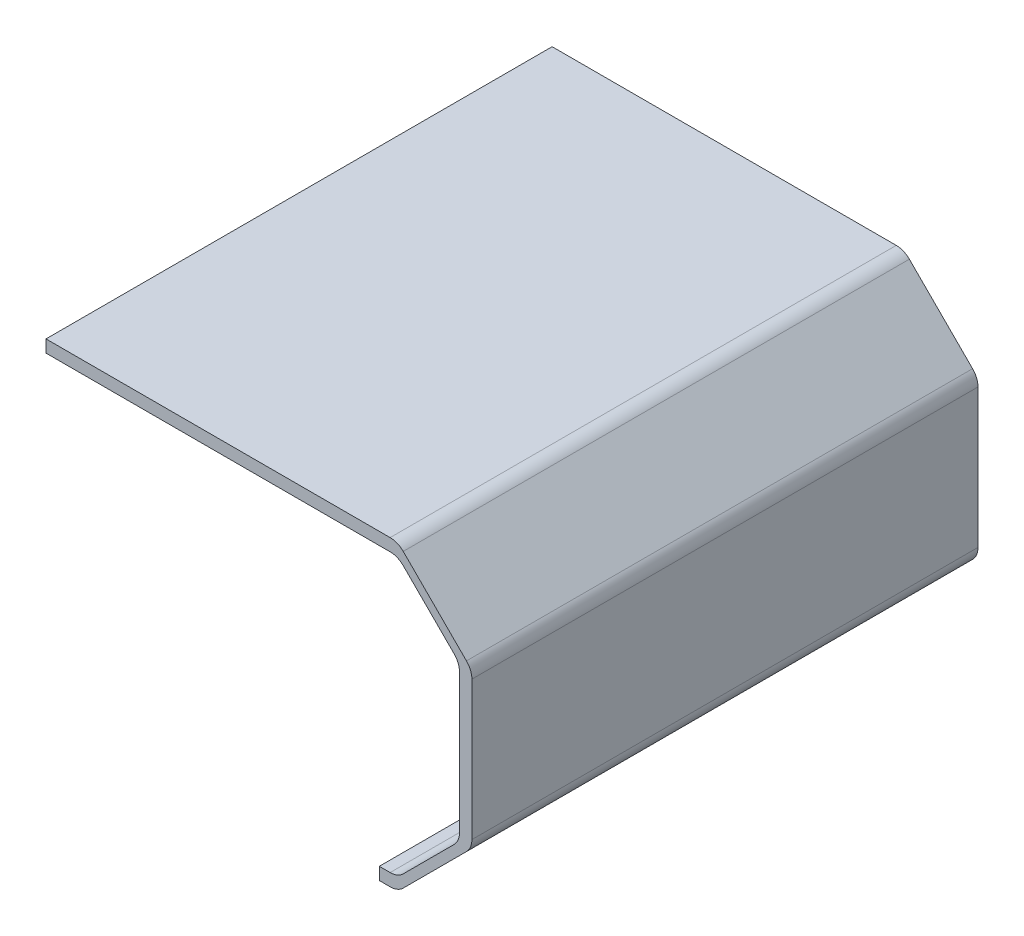
ISO-10303-21;
HEADER;
FILE_DESCRIPTION(('STEP AP214'),'2;1');
FILE_NAME('part.step','',(''),(''),'','','');
FILE_SCHEMA(('AUTOMOTIVE_DESIGN { 1 0 10303 214 1 1 1 1 }'));
ENDSEC;
DATA;
#1=APPLICATION_CONTEXT('core data for automotive mechanical design processes');
#2=APPLICATION_PROTOCOL_DEFINITION('international standard','automotive_design',2000,#1);
#3=PRODUCT_CONTEXT('',#1,'mechanical');
#4=PRODUCT('Part','Part','',(#3));
#5=PRODUCT_RELATED_PRODUCT_CATEGORY('part','',(#4));
#6=PRODUCT_DEFINITION_FORMATION('','',#4);
#7=PRODUCT_DEFINITION_CONTEXT('part definition',#1,'design');
#8=PRODUCT_DEFINITION('design','',#6,#7);
#9=PRODUCT_DEFINITION_SHAPE('','',#8);
#10=(LENGTH_UNIT() NAMED_UNIT(*) SI_UNIT(.MILLI.,.METRE.));
#11=(NAMED_UNIT(*) PLANE_ANGLE_UNIT() SI_UNIT($,.RADIAN.));
#12=(NAMED_UNIT(*) SI_UNIT($,.STERADIAN.) SOLID_ANGLE_UNIT());
#13=UNCERTAINTY_MEASURE_WITH_UNIT(LENGTH_MEASURE(1.E-05),#10,'distance_accuracy_value','');
#14=(GEOMETRIC_REPRESENTATION_CONTEXT(3) GLOBAL_UNCERTAINTY_ASSIGNED_CONTEXT((#13)) GLOBAL_UNIT_ASSIGNED_CONTEXT((#10,
#11,#12)) REPRESENTATION_CONTEXT('',''));
#15=CARTESIAN_POINT('',(0.,0.,0.));
#16=DIRECTION('',(0.,0.,1.));
#17=DIRECTION('',(1.,0.,0.));
#18=AXIS2_PLACEMENT_3D('',#15,#16,#17);
#19=CARTESIAN_POINT('',(0.,0.,82.));
#20=DIRECTION('',(0.,1.,0.));
#21=DIRECTION('',(0.,0.,1.));
#22=AXIS2_PLACEMENT_3D('',#19,#20,#21);
#23=PLANE('',#22);
#24=DIRECTION('',(1.,0.,0.));
#25=VECTOR('',#24,1.);
#26=CARTESIAN_POINT('',(0.,0.,0.));
#27=LINE('',#26,#25);
#28=CARTESIAN_POINT('',(0.,0.,0.));
#29=VERTEX_POINT('',#28);
#30=CARTESIAN_POINT('',(1.75735931288072,0.,0.));
#31=VERTEX_POINT('',#30);
#32=EDGE_CURVE('E229',#29,#31,#27,.T.);
#33=ORIENTED_EDGE('',*,*,#32,.T.);
#34=DIRECTION('',(0.,0.,-1.));
#35=VECTOR('',#34,1.);
#36=CARTESIAN_POINT('',(1.75735931288072,0.,82.));
#37=LINE('',#36,#35);
#38=CARTESIAN_POINT('',(1.75735931288072,0.,82.));
#39=VERTEX_POINT('',#38);
#40=EDGE_CURVE('E327',#31,#39,#37,.F.);
#41=ORIENTED_EDGE('',*,*,#40,.T.);
#42=DIRECTION('',(1.,0.,0.));
#43=VECTOR('',#42,1.);
#44=CARTESIAN_POINT('',(0.,0.,82.));
#45=LINE('',#44,#43);
#46=CARTESIAN_POINT('',(0.,0.,82.));
#47=VERTEX_POINT('',#46);
#48=EDGE_CURVE('E271',#47,#39,#45,.T.);
#49=ORIENTED_EDGE('',*,*,#48,.F.);
#50=DIRECTION('',(0.,0.,-1.));
#51=VECTOR('',#50,1.);
#52=CARTESIAN_POINT('',(0.,0.,82.));
#53=LINE('',#52,#51);
#54=EDGE_CURVE('E228',#47,#29,#53,.T.);
#55=ORIENTED_EDGE('',*,*,#54,.T.);
#56=EDGE_LOOP('',(#33,#41,#49,#55));
#57=FACE_BOUND('',#56,.T.);
#58=ADVANCED_FACE('F39',(#57),#23,.F.);
#59=CARTESIAN_POINT('',(3.,0.,82.));
#60=DIRECTION('',(-0.707106781186547,0.707106781186547,0.));
#61=DIRECTION('',(-0.707106781186548,-0.707106781186548,0.));
#62=AXIS2_PLACEMENT_3D('',#59,#60,#61);
#63=PLANE('',#62);
#64=DIRECTION('',(0.707106781186548,0.707106781186548,0.));
#65=VECTOR('',#64,1.);
#66=CARTESIAN_POINT('',(3.,0.,82.));
#67=LINE('',#66,#65);
#68=CARTESIAN_POINT('',(3.87867965644036,0.878679656440358,82.));
#69=VERTEX_POINT('',#68);
#70=CARTESIAN_POINT('',(14.1213203435628,11.1213203435628,82.));
#71=VERTEX_POINT('',#70);
#72=EDGE_CURVE('E429',#69,#71,#67,.T.);
#73=ORIENTED_EDGE('',*,*,#72,.F.);
#74=DIRECTION('',(0.,0.,-1.));
#75=VECTOR('',#74,1.);
#76=CARTESIAN_POINT('',(3.87867965644036,0.878679656440358,82.));
#77=LINE('',#76,#75);
#78=CARTESIAN_POINT('',(3.87867965644036,0.878679656440358,0.));
#79=VERTEX_POINT('',#78);
#80=EDGE_CURVE('E311',#69,#79,#77,.T.);
#81=ORIENTED_EDGE('',*,*,#80,.T.);
#82=DIRECTION('',(0.707106781186548,0.707106781186548,0.));
#83=VECTOR('',#82,1.);
#84=CARTESIAN_POINT('',(3.,0.,0.));
#85=LINE('',#84,#83);
#86=CARTESIAN_POINT('',(14.1213203435628,11.1213203435628,0.));
#87=VERTEX_POINT('',#86);
#88=EDGE_CURVE('E233',#79,#87,#85,.T.);
#89=ORIENTED_EDGE('',*,*,#88,.T.);
#90=DIRECTION('',(0.,0.,-1.));
#91=VECTOR('',#90,1.);
#92=CARTESIAN_POINT('',(14.1213203435628,11.1213203435628,82.));
#93=LINE('',#92,#91);
#94=EDGE_CURVE('E308',#87,#71,#93,.F.);
#95=ORIENTED_EDGE('',*,*,#94,.T.);
#96=EDGE_LOOP('',(#73,#81,#89,#95));
#97=FACE_BOUND('',#96,.T.);
#98=ADVANCED_FACE('F436',(#97),#63,.F.);
#99=CARTESIAN_POINT('',(15.0000000000032,12.0000000000032,82.));
#100=DIRECTION('',(-1.,0.,0.));
#101=DIRECTION('',(0.,-1.,0.));
#102=AXIS2_PLACEMENT_3D('',#99,#100,#101);
#103=PLANE('',#102);
#104=DIRECTION('',(0.,1.,0.));
#105=VECTOR('',#104,1.);
#106=CARTESIAN_POINT('',(15.0000000000032,12.0000000000032,82.));
#107=LINE('',#106,#105);
#108=CARTESIAN_POINT('',(15.0000000000032,13.2426406871225,82.));
#109=VERTEX_POINT('',#108);
#110=CARTESIAN_POINT('',(15.0000000000032,35.7573593128778,82.));
#111=VERTEX_POINT('',#110);
#112=EDGE_CURVE('E449',#109,#111,#107,.T.);
#113=ORIENTED_EDGE('',*,*,#112,.F.);
#114=DIRECTION('',(0.,0.,-1.));
#115=VECTOR('',#114,1.);
#116=CARTESIAN_POINT('',(15.0000000000032,13.2426406871225,82.));
#117=LINE('',#116,#115);
#118=CARTESIAN_POINT('',(15.0000000000032,13.2426406871225,0.));
#119=VERTEX_POINT('',#118);
#120=EDGE_CURVE('E344',#109,#119,#117,.T.);
#121=ORIENTED_EDGE('',*,*,#120,.T.);
#122=DIRECTION('',(0.,1.,0.));
#123=VECTOR('',#122,1.);
#124=CARTESIAN_POINT('',(15.0000000000032,12.0000000000032,0.));
#125=LINE('',#124,#123);
#126=CARTESIAN_POINT('',(15.0000000000032,35.7573593128778,0.));
#127=VERTEX_POINT('',#126);
#128=EDGE_CURVE('E237',#119,#127,#125,.T.);
#129=ORIENTED_EDGE('',*,*,#128,.T.);
#130=DIRECTION('',(0.,0.,-1.));
#131=VECTOR('',#130,1.);
#132=CARTESIAN_POINT('',(15.0000000000032,35.7573593128779,82.));
#133=LINE('',#132,#131);
#134=EDGE_CURVE('E341',#127,#111,#133,.F.);
#135=ORIENTED_EDGE('',*,*,#134,.T.);
#136=EDGE_LOOP('',(#113,#121,#129,#135));
#137=FACE_BOUND('',#136,.T.);
#138=ADVANCED_FACE('F446',(#137),#103,.F.);
#139=CARTESIAN_POINT('',(3.00000000000458,48.9999999999954,82.));
#140=DIRECTION('',(-0.707106781186537,-0.707106781186558,0.));
#141=DIRECTION('',(0.707106781186558,-0.707106781186537,0.));
#142=AXIS2_PLACEMENT_3D('',#139,#140,#141);
#143=PLANE('',#142);
#144=DIRECTION('',(-0.707106781186558,0.707106781186537,0.));
#145=VECTOR('',#144,1.);
#146=CARTESIAN_POINT('',(3.00000000000458,48.9999999999954,82.));
#147=LINE('',#146,#145);
#148=CARTESIAN_POINT('',(14.1213203435628,37.8786796564375,82.));
#149=VERTEX_POINT('',#148);
#150=CARTESIAN_POINT('',(3.87867965644493,48.1213203435551,82.));
#151=VERTEX_POINT('',#150);
#152=EDGE_CURVE('E187',#149,#151,#147,.T.);
#153=ORIENTED_EDGE('',*,*,#152,.F.);
#154=DIRECTION('',(0.,0.,-1.));
#155=VECTOR('',#154,1.);
#156=CARTESIAN_POINT('',(14.1213203435628,37.8786796564375,82.));
#157=LINE('',#156,#155);
#158=CARTESIAN_POINT('',(14.1213203435628,37.8786796564375,0.));
#159=VERTEX_POINT('',#158);
#160=EDGE_CURVE('E350',#149,#159,#157,.T.);
#161=ORIENTED_EDGE('',*,*,#160,.T.);
#162=DIRECTION('',(-0.707106781186558,0.707106781186537,0.));
#163=VECTOR('',#162,1.);
#164=CARTESIAN_POINT('',(3.00000000000458,48.9999999999954,0.));
#165=LINE('',#164,#163);
#166=CARTESIAN_POINT('',(3.87867965644493,48.1213203435551,0.));
#167=VERTEX_POINT('',#166);
#168=EDGE_CURVE('E241',#159,#167,#165,.T.);
#169=ORIENTED_EDGE('',*,*,#168,.T.);
#170=DIRECTION('',(0.,0.,-1.));
#171=VECTOR('',#170,1.);
#172=CARTESIAN_POINT('',(3.87867965644493,48.1213203435551,82.));
#173=LINE('',#172,#171);
#174=EDGE_CURVE('E63',#167,#151,#173,.F.);
#175=ORIENTED_EDGE('',*,*,#174,.T.);
#176=EDGE_LOOP('',(#153,#161,#169,#175));
#177=FACE_BOUND('',#176,.T.);
#178=ADVANCED_FACE('F459',(#177),#143,.F.);
#179=CARTESIAN_POINT('',(-54.,48.9999999999956,82.));
#180=DIRECTION('',(0.,-1.,0.));
#181=DIRECTION('',(1.,0.,0.));
#182=AXIS2_PLACEMENT_3D('',#179,#180,#181);
#183=PLANE('',#182);
#184=DIRECTION('',(-1.,0.,0.));
#185=VECTOR('',#184,1.);
#186=CARTESIAN_POINT('',(-54.,48.9999999999956,82.));
#187=LINE('',#186,#185);
#188=CARTESIAN_POINT('',(1.75735931288532,48.9999999999954,82.));
#189=VERTEX_POINT('',#188);
#190=CARTESIAN_POINT('',(-54.,48.9999999999956,82.));
#191=VERTEX_POINT('',#190);
#192=EDGE_CURVE('E175',#189,#191,#187,.T.);
#193=ORIENTED_EDGE('',*,*,#192,.F.);
#194=DIRECTION('',(0.,0.,-1.));
#195=VECTOR('',#194,1.);
#196=CARTESIAN_POINT('',(1.75735931288532,48.9999999999954,82.));
#197=LINE('',#196,#195);
#198=CARTESIAN_POINT('',(1.75735931288532,48.9999999999954,0.));
#199=VERTEX_POINT('',#198);
#200=EDGE_CURVE('E354',#189,#199,#197,.T.);
#201=ORIENTED_EDGE('',*,*,#200,.T.);
#202=DIRECTION('',(-1.,0.,0.));
#203=VECTOR('',#202,1.);
#204=CARTESIAN_POINT('',(-54.,48.9999999999956,0.));
#205=LINE('',#204,#203);
#206=CARTESIAN_POINT('',(-54.,48.9999999999956,0.));
#207=VERTEX_POINT('',#206);
#208=EDGE_CURVE('E193',#199,#207,#205,.T.);
#209=ORIENTED_EDGE('',*,*,#208,.T.);
#210=DIRECTION('',(0.,0.,-1.));
#211=VECTOR('',#210,1.);
#212=CARTESIAN_POINT('',(-54.,48.9999999999956,82.));
#213=LINE('',#212,#211);
#214=EDGE_CURVE('E190',#191,#207,#213,.T.);
#215=ORIENTED_EDGE('',*,*,#214,.F.);
#216=EDGE_LOOP('',(#193,#201,#209,#215));
#217=FACE_BOUND('',#216,.T.);
#218=ADVANCED_FACE('F191',(#217),#183,.F.);
#219=CARTESIAN_POINT('',(-54.,48.9999999999956,82.));
#220=DIRECTION('',(1.,0.,0.));
#221=DIRECTION('',(0.,0.,-1.));
#222=AXIS2_PLACEMENT_3D('',#219,#220,#221);
#223=PLANE('',#222);
#224=DIRECTION('',(0.,-1.,0.));
#225=VECTOR('',#224,1.);
#226=CARTESIAN_POINT('',(-54.,48.9999999999956,0.));
#227=LINE('',#226,#225);
#228=CARTESIAN_POINT('',(-54.,46.9999999999961,0.));
#229=VERTEX_POINT('',#228);
#230=EDGE_CURVE('E246',#207,#229,#227,.T.);
#231=ORIENTED_EDGE('',*,*,#230,.T.);
#232=DIRECTION('',(0.,0.,-1.));
#233=VECTOR('',#232,1.);
#234=CARTESIAN_POINT('',(-54.,46.9999999999961,82.));
#235=LINE('',#234,#233);
#236=CARTESIAN_POINT('',(-54.,46.9999999999961,82.));
#237=VERTEX_POINT('',#236);
#238=EDGE_CURVE('E198',#237,#229,#235,.T.);
#239=ORIENTED_EDGE('',*,*,#238,.F.);
#240=DIRECTION('',(0.,-1.,0.));
#241=VECTOR('',#240,1.);
#242=CARTESIAN_POINT('',(-54.,48.9999999999956,82.));
#243=LINE('',#242,#241);
#244=EDGE_CURVE('E181',#191,#237,#243,.T.);
#245=ORIENTED_EDGE('',*,*,#244,.F.);
#246=ORIENTED_EDGE('',*,*,#214,.T.);
#247=EDGE_LOOP('',(#231,#239,#245,#246));
#248=FACE_BOUND('',#247,.T.);
#249=ADVANCED_FACE('F200',(#248),#223,.F.);
#250=CARTESIAN_POINT('',(3.00000000000477,46.9999999999961,82.));
#251=DIRECTION('',(0.,1.,0.));
#252=DIRECTION('',(0.,0.,1.));
#253=AXIS2_PLACEMENT_3D('',#250,#251,#252);
#254=PLANE('',#253);
#255=DIRECTION('',(1.,0.,0.));
#256=VECTOR('',#255,1.);
#257=CARTESIAN_POINT('',(3.00000000000477,46.9999999999961,0.));
#258=LINE('',#257,#256);
#259=CARTESIAN_POINT('',(1.75735931288549,46.9999999999961,0.));
#260=VERTEX_POINT('',#259);
#261=EDGE_CURVE('E249',#229,#260,#258,.T.);
#262=ORIENTED_EDGE('',*,*,#261,.T.);
#263=DIRECTION('',(0.,0.,-1.));
#264=VECTOR('',#263,1.);
#265=CARTESIAN_POINT('',(1.75735931288549,46.9999999999961,82.));
#266=LINE('',#265,#264);
#267=CARTESIAN_POINT('',(1.75735931288549,46.9999999999961,82.));
#268=VERTEX_POINT('',#267);
#269=EDGE_CURVE('E305',#260,#268,#266,.F.);
#270=ORIENTED_EDGE('',*,*,#269,.T.);
#271=DIRECTION('',(1.,0.,0.));
#272=VECTOR('',#271,1.);
#273=CARTESIAN_POINT('',(3.00000000000477,46.9999999999961,82.));
#274=LINE('',#273,#272);
#275=EDGE_CURVE('E204',#237,#268,#274,.T.);
#276=ORIENTED_EDGE('',*,*,#275,.F.);
#277=ORIENTED_EDGE('',*,*,#238,.T.);
#278=EDGE_LOOP('',(#262,#270,#276,#277));
#279=FACE_BOUND('',#278,.T.);
#280=ADVANCED_FACE('F384',(#279),#254,.F.);
#281=CARTESIAN_POINT('',(3.00000000000477,46.9999999999961,82.));
#282=DIRECTION('',(0.707106781186547,0.707106781186548,0.));
#283=DIRECTION('',(-0.707106781186548,0.707106781186547,0.));
#284=AXIS2_PLACEMENT_3D('',#281,#282,#283);
#285=PLANE('',#284);
#286=DIRECTION('',(0.707106781186548,-0.707106781186547,0.));
#287=VECTOR('',#286,1.);
#288=CARTESIAN_POINT('',(3.00000000000477,46.9999999999961,0.));
#289=LINE('',#288,#287);
#290=CARTESIAN_POINT('',(3.87867965644513,46.1213203435558,0.));
#291=VERTEX_POINT('',#290);
#292=CARTESIAN_POINT('',(12.1213203435631,37.8786796564378,0.));
#293=VERTEX_POINT('',#292);
#294=EDGE_CURVE('E253',#291,#293,#289,.T.);
#295=ORIENTED_EDGE('',*,*,#294,.T.);
#296=DIRECTION('',(0.,0.,-1.));
#297=VECTOR('',#296,1.);
#298=CARTESIAN_POINT('',(12.1213203435631,37.8786796564378,82.));
#299=LINE('',#298,#297);
#300=CARTESIAN_POINT('',(12.1213203435631,37.8786796564378,82.));
#301=VERTEX_POINT('',#300);
#302=EDGE_CURVE('E302',#293,#301,#299,.F.);
#303=ORIENTED_EDGE('',*,*,#302,.T.);
#304=DIRECTION('',(0.707106781186548,-0.707106781186547,0.));
#305=VECTOR('',#304,1.);
#306=CARTESIAN_POINT('',(3.00000000000477,46.9999999999961,82.));
#307=LINE('',#306,#305);
#308=CARTESIAN_POINT('',(3.87867965644513,46.1213203435558,82.));
#309=VERTEX_POINT('',#308);
#310=EDGE_CURVE('E207',#309,#301,#307,.T.);
#311=ORIENTED_EDGE('',*,*,#310,.F.);
#312=DIRECTION('',(0.,0.,-1.));
#313=VECTOR('',#312,1.);
#314=CARTESIAN_POINT('',(3.87867965644513,46.1213203435558,0.));
#315=LINE('',#314,#313);
#316=EDGE_CURVE('E298',#309,#291,#315,.T.);
#317=ORIENTED_EDGE('',*,*,#316,.T.);
#318=EDGE_LOOP('',(#295,#303,#311,#317));
#319=FACE_BOUND('',#318,.T.);
#320=ADVANCED_FACE('F390',(#319),#285,.F.);
#321=CARTESIAN_POINT('',(13.0000000000035,36.9999999999974,82.));
#322=DIRECTION('',(1.,0.,0.));
#323=DIRECTION('',(0.,1.,0.));
#324=AXIS2_PLACEMENT_3D('',#321,#322,#323);
#325=PLANE('',#324);
#326=DIRECTION('',(0.,-1.,0.));
#327=VECTOR('',#326,1.);
#328=CARTESIAN_POINT('',(13.0000000000035,36.9999999999974,0.));
#329=LINE('',#328,#327);
#330=CARTESIAN_POINT('',(13.0000000000035,35.7573593128782,0.));
#331=VERTEX_POINT('',#330);
#332=CARTESIAN_POINT('',(13.0000000000035,13.2426406871171,0.));
#333=VERTEX_POINT('',#332);
#334=EDGE_CURVE('E257',#331,#333,#329,.T.);
#335=ORIENTED_EDGE('',*,*,#334,.T.);
#336=DIRECTION('',(0.,0.,-1.));
#337=VECTOR('',#336,1.);
#338=CARTESIAN_POINT('',(13.0000000000035,13.2426406871171,82.));
#339=LINE('',#338,#337);
#340=CARTESIAN_POINT('',(13.0000000000035,13.2426406871171,82.));
#341=VERTEX_POINT('',#340);
#342=EDGE_CURVE('E295',#333,#341,#339,.F.);
#343=ORIENTED_EDGE('',*,*,#342,.T.);
#344=DIRECTION('',(0.,-1.,0.));
#345=VECTOR('',#344,1.);
#346=CARTESIAN_POINT('',(13.0000000000035,36.9999999999974,82.));
#347=LINE('',#346,#345);
#348=CARTESIAN_POINT('',(13.0000000000035,35.7573593128782,82.));
#349=VERTEX_POINT('',#348);
#350=EDGE_CURVE('E214',#349,#341,#347,.T.);
#351=ORIENTED_EDGE('',*,*,#350,.F.);
#352=DIRECTION('',(0.,0.,-1.));
#353=VECTOR('',#352,1.);
#354=CARTESIAN_POINT('',(13.0000000000035,35.7573593128782,0.));
#355=LINE('',#354,#353);
#356=EDGE_CURVE('E291',#349,#331,#355,.T.);
#357=ORIENTED_EDGE('',*,*,#356,.T.);
#358=EDGE_LOOP('',(#335,#343,#351,#357));
#359=FACE_BOUND('',#358,.T.);
#360=ADVANCED_FACE('F398',(#359),#325,.F.);
#361=CARTESIAN_POINT('',(3.00000000000361,1.99999999999793,82.));
#362=DIRECTION('',(0.707106781186548,-0.707106781186548,0.));
#363=DIRECTION('',(0.707106781186548,0.707106781186548,0.));
#364=AXIS2_PLACEMENT_3D('',#361,#362,#363);
#365=PLANE('',#364);
#366=DIRECTION('',(-0.707106781186547,-0.707106781186547,0.));
#367=VECTOR('',#366,1.);
#368=CARTESIAN_POINT('',(3.00000000000361,1.99999999999793,0.));
#369=LINE('',#368,#367);
#370=CARTESIAN_POINT('',(12.1213203435631,11.1213203435574,0.));
#371=VERTEX_POINT('',#370);
#372=CARTESIAN_POINT('',(3.87867965644396,2.87867965643829,0.));
#373=VERTEX_POINT('',#372);
#374=EDGE_CURVE('E261',#371,#373,#369,.T.);
#375=ORIENTED_EDGE('',*,*,#374,.T.);
#376=DIRECTION('',(0.,0.,-1.));
#377=VECTOR('',#376,1.);
#378=CARTESIAN_POINT('',(3.87867965644396,2.87867965643829,82.));
#379=LINE('',#378,#377);
#380=CARTESIAN_POINT('',(3.87867965644396,2.87867965643829,82.));
#381=VERTEX_POINT('',#380);
#382=EDGE_CURVE('E288',#373,#381,#379,.F.);
#383=ORIENTED_EDGE('',*,*,#382,.T.);
#384=DIRECTION('',(-0.707106781186547,-0.707106781186547,0.));
#385=VECTOR('',#384,1.);
#386=CARTESIAN_POINT('',(3.00000000000361,1.99999999999793,82.));
#387=LINE('',#386,#385);
#388=CARTESIAN_POINT('',(12.1213203435631,11.1213203435574,82.));
#389=VERTEX_POINT('',#388);
#390=EDGE_CURVE('E218',#389,#381,#387,.T.);
#391=ORIENTED_EDGE('',*,*,#390,.F.);
#392=DIRECTION('',(0.,0.,-1.));
#393=VECTOR('',#392,1.);
#394=CARTESIAN_POINT('',(12.1213203435631,11.1213203435574,0.));
#395=LINE('',#394,#393);
#396=EDGE_CURVE('E284',#389,#371,#395,.T.);
#397=ORIENTED_EDGE('',*,*,#396,.T.);
#398=EDGE_LOOP('',(#375,#383,#391,#397));
#399=FACE_BOUND('',#398,.T.);
#400=ADVANCED_FACE('F407',(#399),#365,.F.);
#401=CARTESIAN_POINT('',(0.,1.99999999999793,82.));
#402=DIRECTION('',(0.,-1.,0.));
#403=DIRECTION('',(1.,0.,0.));
#404=AXIS2_PLACEMENT_3D('',#401,#402,#403);
#405=PLANE('',#404);
#406=DIRECTION('',(-1.,0.,0.));
#407=VECTOR('',#406,1.);
#408=CARTESIAN_POINT('',(0.,1.99999999999793,82.));
#409=LINE('',#408,#407);
#410=CARTESIAN_POINT('',(1.75735931288432,1.99999999999793,82.));
#411=VERTEX_POINT('',#410);
#412=CARTESIAN_POINT('',(0.,1.99999999999793,82.));
#413=VERTEX_POINT('',#412);
#414=EDGE_CURVE('E222',#411,#413,#409,.T.);
#415=ORIENTED_EDGE('',*,*,#414,.F.);
#416=DIRECTION('',(0.,0.,-1.));
#417=VECTOR('',#416,1.);
#418=CARTESIAN_POINT('',(1.75735931288432,1.99999999999793,0.));
#419=LINE('',#418,#417);
#420=CARTESIAN_POINT('',(1.75735931288432,1.99999999999793,0.));
#421=VERTEX_POINT('',#420);
#422=EDGE_CURVE('E197',#411,#421,#419,.T.);
#423=ORIENTED_EDGE('',*,*,#422,.T.);
#424=DIRECTION('',(-1.,0.,0.));
#425=VECTOR('',#424,1.);
#426=CARTESIAN_POINT('',(0.,1.99999999999793,0.));
#427=LINE('',#426,#425);
#428=CARTESIAN_POINT('',(0.,1.99999999999793,0.));
#429=VERTEX_POINT('',#428);
#430=EDGE_CURVE('E265',#421,#429,#427,.T.);
#431=ORIENTED_EDGE('',*,*,#430,.T.);
#432=DIRECTION('',(0.,0.,-1.));
#433=VECTOR('',#432,1.);
#434=CARTESIAN_POINT('',(0.,1.99999999999793,82.));
#435=LINE('',#434,#433);
#436=EDGE_CURVE('E275',#413,#429,#435,.T.);
#437=ORIENTED_EDGE('',*,*,#436,.F.);
#438=EDGE_LOOP('',(#415,#423,#431,#437));
#439=FACE_BOUND('',#438,.T.);
#440=ADVANCED_FACE('F416',(#439),#405,.F.);
#441=CARTESIAN_POINT('',(0.,0.,82.));
#442=DIRECTION('',(1.,0.,0.));
#443=DIRECTION('',(0.,0.,-1.));
#444=AXIS2_PLACEMENT_3D('',#441,#442,#443);
#445=PLANE('',#444);
#446=DIRECTION('',(0.,-1.,0.));
#447=VECTOR('',#446,1.);
#448=CARTESIAN_POINT('',(0.,0.,0.));
#449=LINE('',#448,#447);
#450=EDGE_CURVE('E268',#429,#29,#449,.T.);
#451=ORIENTED_EDGE('',*,*,#450,.T.);
#452=ORIENTED_EDGE('',*,*,#54,.F.);
#453=DIRECTION('',(0.,-1.,0.));
#454=VECTOR('',#453,1.);
#455=CARTESIAN_POINT('',(0.,0.,82.));
#456=LINE('',#455,#454);
#457=EDGE_CURVE('E225',#413,#47,#456,.T.);
#458=ORIENTED_EDGE('',*,*,#457,.F.);
#459=ORIENTED_EDGE('',*,*,#436,.T.);
#460=EDGE_LOOP('',(#451,#452,#458,#459));
#461=FACE_BOUND('',#460,.T.);
#462=ADVANCED_FACE('F422',(#461),#445,.F.);
#463=CARTESIAN_POINT('',(0.,0.,82.));
#464=DIRECTION('',(0.,0.,1.));
#465=DIRECTION('',(1.,0.,0.));
#466=AXIS2_PLACEMENT_3D('',#463,#464,#465);
#467=PLANE('',#466);
#468=ORIENTED_EDGE('',*,*,#48,.T.);
#469=CARTESIAN_POINT('',(1.75735931288072,3.,82.));
#470=DIRECTION('',(0.,0.,1.));
#471=DIRECTION('',(1.,0.,0.));
#472=AXIS2_PLACEMENT_3D('',#469,#470,#471);
#473=CIRCLE('',#472,3.);
#474=EDGE_CURVE('E338',#39,#69,#473,.T.);
#475=ORIENTED_EDGE('',*,*,#474,.T.);
#476=ORIENTED_EDGE('',*,*,#72,.T.);
#477=CARTESIAN_POINT('',(12.0000000000032,13.2426406871225,82.));
#478=DIRECTION('',(0.,0.,1.));
#479=DIRECTION('',(1.,0.,0.));
#480=AXIS2_PLACEMENT_3D('',#477,#478,#479);
#481=CIRCLE('',#480,3.);
#482=EDGE_CURVE('E335',#71,#109,#481,.T.);
#483=ORIENTED_EDGE('',*,*,#482,.T.);
#484=ORIENTED_EDGE('',*,*,#112,.T.);
#485=CARTESIAN_POINT('',(12.0000000000032,35.7573593128779,82.));
#486=DIRECTION('',(0.,0.,1.));
#487=DIRECTION('',(1.,0.,0.));
#488=AXIS2_PLACEMENT_3D('',#485,#486,#487);
#489=CIRCLE('',#488,3.);
#490=EDGE_CURVE('E332',#111,#149,#489,.T.);
#491=ORIENTED_EDGE('',*,*,#490,.T.);
#492=ORIENTED_EDGE('',*,*,#152,.T.);
#493=CARTESIAN_POINT('',(1.75735931288531,45.9999999999954,82.));
#494=DIRECTION('',(0.,0.,1.));
#495=DIRECTION('',(1.,0.,0.));
#496=AXIS2_PLACEMENT_3D('',#493,#494,#495);
#497=CIRCLE('',#496,3.);
#498=EDGE_CURVE('E55',#151,#189,#497,.T.);
#499=ORIENTED_EDGE('',*,*,#498,.T.);
#500=ORIENTED_EDGE('',*,*,#192,.T.);
#501=ORIENTED_EDGE('',*,*,#244,.T.);
#502=ORIENTED_EDGE('',*,*,#275,.T.);
#503=CARTESIAN_POINT('',(1.75735931288549,43.9999999999961,82.));
#504=DIRECTION('',(0.,0.,1.));
#505=DIRECTION('',(1.,0.,0.));
#506=AXIS2_PLACEMENT_3D('',#503,#504,#505);
#507=CIRCLE('',#506,3.);
#508=EDGE_CURVE('E11',#268,#309,#507,.F.);
#509=ORIENTED_EDGE('',*,*,#508,.T.);
#510=ORIENTED_EDGE('',*,*,#310,.T.);
#511=CARTESIAN_POINT('',(10.0000000000034,35.7573593128782,82.));
#512=DIRECTION('',(0.,0.,1.));
#513=DIRECTION('',(1.,0.,0.));
#514=AXIS2_PLACEMENT_3D('',#511,#512,#513);
#515=CIRCLE('',#514,3.);
#516=EDGE_CURVE('E372',#301,#349,#515,.F.);
#517=ORIENTED_EDGE('',*,*,#516,.T.);
#518=ORIENTED_EDGE('',*,*,#350,.T.);
#519=CARTESIAN_POINT('',(10.0000000000035,13.2426406871171,82.));
#520=DIRECTION('',(0.,0.,1.));
#521=DIRECTION('',(1.,0.,0.));
#522=AXIS2_PLACEMENT_3D('',#519,#520,#521);
#523=CIRCLE('',#522,3.);
#524=EDGE_CURVE('E366',#341,#389,#523,.F.);
#525=ORIENTED_EDGE('',*,*,#524,.T.);
#526=ORIENTED_EDGE('',*,*,#390,.T.);
#527=CARTESIAN_POINT('',(1.75735931288432,4.99999999999793,82.));
#528=DIRECTION('',(0.,0.,1.));
#529=DIRECTION('',(1.,0.,0.));
#530=AXIS2_PLACEMENT_3D('',#527,#528,#529);
#531=CIRCLE('',#530,3.);
#532=EDGE_CURVE('E360',#381,#411,#531,.F.);
#533=ORIENTED_EDGE('',*,*,#532,.T.);
#534=ORIENTED_EDGE('',*,*,#414,.T.);
#535=ORIENTED_EDGE('',*,*,#457,.T.);
#536=EDGE_LOOP('',(#468,#475,#476,#483,#484,#491,#492,#499,#500,#501,#502,#509,#510,#517,#518,
#525,#526,#533,#534,#535));
#537=FACE_BOUND('',#536,.T.);
#538=ADVANCED_FACE('F178',(#537),#467,.T.);
#539=CARTESIAN_POINT('',(0.,0.,0.));
#540=DIRECTION('',(0.,0.,1.));
#541=DIRECTION('',(1.,0.,0.));
#542=AXIS2_PLACEMENT_3D('',#539,#540,#541);
#543=PLANE('',#542);
#544=ORIENTED_EDGE('',*,*,#88,.F.);
#545=CARTESIAN_POINT('',(1.75735931288072,3.,0.));
#546=DIRECTION('',(0.,0.,1.));
#547=DIRECTION('',(1.,0.,0.));
#548=AXIS2_PLACEMENT_3D('',#545,#546,#547);
#549=CIRCLE('',#548,3.);
#550=EDGE_CURVE('E324',#79,#31,#549,.F.);
#551=ORIENTED_EDGE('',*,*,#550,.T.);
#552=ORIENTED_EDGE('',*,*,#32,.F.);
#553=ORIENTED_EDGE('',*,*,#450,.F.);
#554=ORIENTED_EDGE('',*,*,#430,.F.);
#555=CARTESIAN_POINT('',(1.75735931288432,4.99999999999793,0.));
#556=DIRECTION('',(0.,0.,1.));
#557=DIRECTION('',(1.,0.,0.));
#558=AXIS2_PLACEMENT_3D('',#555,#556,#557);
#559=CIRCLE('',#558,3.);
#560=EDGE_CURVE('E357',#421,#373,#559,.T.);
#561=ORIENTED_EDGE('',*,*,#560,.T.);
#562=ORIENTED_EDGE('',*,*,#374,.F.);
#563=CARTESIAN_POINT('',(10.0000000000035,13.2426406871171,0.));
#564=DIRECTION('',(0.,0.,1.));
#565=DIRECTION('',(1.,0.,0.));
#566=AXIS2_PLACEMENT_3D('',#563,#564,#565);
#567=CIRCLE('',#566,3.);
#568=EDGE_CURVE('E363',#371,#333,#567,.T.);
#569=ORIENTED_EDGE('',*,*,#568,.T.);
#570=ORIENTED_EDGE('',*,*,#334,.F.);
#571=CARTESIAN_POINT('',(10.0000000000034,35.7573593128782,0.));
#572=DIRECTION('',(0.,0.,1.));
#573=DIRECTION('',(1.,0.,0.));
#574=AXIS2_PLACEMENT_3D('',#571,#572,#573);
#575=CIRCLE('',#574,3.);
#576=EDGE_CURVE('E369',#331,#293,#575,.T.);
#577=ORIENTED_EDGE('',*,*,#576,.T.);
#578=ORIENTED_EDGE('',*,*,#294,.F.);
#579=CARTESIAN_POINT('',(1.75735931288549,43.9999999999961,0.));
#580=DIRECTION('',(0.,0.,1.));
#581=DIRECTION('',(1.,0.,0.));
#582=AXIS2_PLACEMENT_3D('',#579,#580,#581);
#583=CIRCLE('',#582,3.);
#584=EDGE_CURVE('E48',#291,#260,#583,.T.);
#585=ORIENTED_EDGE('',*,*,#584,.T.);
#586=ORIENTED_EDGE('',*,*,#261,.F.);
#587=ORIENTED_EDGE('',*,*,#230,.F.);
#588=ORIENTED_EDGE('',*,*,#208,.F.);
#589=CARTESIAN_POINT('',(1.75735931288531,45.9999999999954,0.));
#590=DIRECTION('',(0.,0.,1.));
#591=DIRECTION('',(1.,0.,0.));
#592=AXIS2_PLACEMENT_3D('',#589,#590,#591);
#593=CIRCLE('',#592,3.);
#594=EDGE_CURVE('E315',#199,#167,#593,.F.);
#595=ORIENTED_EDGE('',*,*,#594,.T.);
#596=ORIENTED_EDGE('',*,*,#168,.F.);
#597=CARTESIAN_POINT('',(12.0000000000032,35.7573593128779,0.));
#598=DIRECTION('',(0.,0.,1.));
#599=DIRECTION('',(1.,0.,0.));
#600=AXIS2_PLACEMENT_3D('',#597,#598,#599);
#601=CIRCLE('',#600,3.);
#602=EDGE_CURVE('E318',#159,#127,#601,.F.);
#603=ORIENTED_EDGE('',*,*,#602,.T.);
#604=ORIENTED_EDGE('',*,*,#128,.F.);
#605=CARTESIAN_POINT('',(12.0000000000032,13.2426406871225,0.));
#606=DIRECTION('',(0.,0.,1.));
#607=DIRECTION('',(1.,0.,0.));
#608=AXIS2_PLACEMENT_3D('',#605,#606,#607);
#609=CIRCLE('',#608,3.);
#610=EDGE_CURVE('E321',#119,#87,#609,.F.);
#611=ORIENTED_EDGE('',*,*,#610,.T.);
#612=EDGE_LOOP('',(#544,#551,#552,#553,#554,#561,#562,#569,#570,#577,#578,#585,#586,#587,#588,
#595,#596,#603,#604,#611));
#613=FACE_BOUND('',#612,.T.);
#614=ADVANCED_FACE('F379',(#613),#543,.F.);
#615=CARTESIAN_POINT('',(1.75735931288432,4.99999999999793,82.));
#616=DIRECTION('',(0.,0.,1.));
#617=DIRECTION('',(1.,0.,0.));
#618=AXIS2_PLACEMENT_3D('',#615,#616,#617);
#619=CYLINDRICAL_SURFACE('',#618,3.);
#620=ORIENTED_EDGE('',*,*,#532,.F.);
#621=ORIENTED_EDGE('',*,*,#382,.F.);
#622=ORIENTED_EDGE('',*,*,#560,.F.);
#623=ORIENTED_EDGE('',*,*,#422,.F.);
#624=EDGE_LOOP('',(#620,#621,#622,#623));
#625=FACE_BOUND('',#624,.T.);
#626=ADVANCED_FACE('F411',(#625),#619,.F.);
#627=CARTESIAN_POINT('',(10.0000000000035,13.2426406871171,82.));
#628=DIRECTION('',(0.,0.,1.));
#629=DIRECTION('',(1.,0.,0.));
#630=AXIS2_PLACEMENT_3D('',#627,#628,#629);
#631=CYLINDRICAL_SURFACE('',#630,3.);
#632=ORIENTED_EDGE('',*,*,#524,.F.);
#633=ORIENTED_EDGE('',*,*,#342,.F.);
#634=ORIENTED_EDGE('',*,*,#568,.F.);
#635=ORIENTED_EDGE('',*,*,#396,.F.);
#636=EDGE_LOOP('',(#632,#633,#634,#635));
#637=FACE_BOUND('',#636,.T.);
#638=ADVANCED_FACE('F402',(#637),#631,.F.);
#639=CARTESIAN_POINT('',(10.0000000000034,35.7573593128782,82.));
#640=DIRECTION('',(0.,0.,1.));
#641=DIRECTION('',(1.,0.,0.));
#642=AXIS2_PLACEMENT_3D('',#639,#640,#641);
#643=CYLINDRICAL_SURFACE('',#642,3.);
#644=ORIENTED_EDGE('',*,*,#516,.F.);
#645=ORIENTED_EDGE('',*,*,#302,.F.);
#646=ORIENTED_EDGE('',*,*,#576,.F.);
#647=ORIENTED_EDGE('',*,*,#356,.F.);
#648=EDGE_LOOP('',(#644,#645,#646,#647));
#649=FACE_BOUND('',#648,.T.);
#650=ADVANCED_FACE('F393',(#649),#643,.F.);
#651=CARTESIAN_POINT('',(1.75735931288549,43.9999999999961,82.));
#652=DIRECTION('',(0.,0.,1.));
#653=DIRECTION('',(1.,0.,0.));
#654=AXIS2_PLACEMENT_3D('',#651,#652,#653);
#655=CYLINDRICAL_SURFACE('',#654,3.);
#656=ORIENTED_EDGE('',*,*,#508,.F.);
#657=ORIENTED_EDGE('',*,*,#269,.F.);
#658=ORIENTED_EDGE('',*,*,#584,.F.);
#659=ORIENTED_EDGE('',*,*,#316,.F.);
#660=EDGE_LOOP('',(#656,#657,#658,#659));
#661=FACE_BOUND('',#660,.T.);
#662=ADVANCED_FACE('F386',(#661),#655,.F.);
#663=CARTESIAN_POINT('',(1.75735931288072,3.,82.));
#664=DIRECTION('',(0.,0.,-1.));
#665=DIRECTION('',(-1.,0.,0.));
#666=AXIS2_PLACEMENT_3D('',#663,#664,#665);
#667=CYLINDRICAL_SURFACE('',#666,3.);
#668=ORIENTED_EDGE('',*,*,#474,.F.);
#669=ORIENTED_EDGE('',*,*,#40,.F.);
#670=ORIENTED_EDGE('',*,*,#550,.F.);
#671=ORIENTED_EDGE('',*,*,#80,.F.);
#672=EDGE_LOOP('',(#668,#669,#670,#671));
#673=FACE_BOUND('',#672,.T.);
#674=ADVANCED_FACE('F434',(#673),#667,.T.);
#675=CARTESIAN_POINT('',(12.0000000000032,13.2426406871225,82.));
#676=DIRECTION('',(0.,0.,-1.));
#677=DIRECTION('',(-1.,0.,0.));
#678=AXIS2_PLACEMENT_3D('',#675,#676,#677);
#679=CYLINDRICAL_SURFACE('',#678,3.);
#680=ORIENTED_EDGE('',*,*,#482,.F.);
#681=ORIENTED_EDGE('',*,*,#94,.F.);
#682=ORIENTED_EDGE('',*,*,#610,.F.);
#683=ORIENTED_EDGE('',*,*,#120,.F.);
#684=EDGE_LOOP('',(#680,#681,#682,#683));
#685=FACE_BOUND('',#684,.T.);
#686=ADVANCED_FACE('F443',(#685),#679,.T.);
#687=CARTESIAN_POINT('',(12.0000000000032,35.7573593128779,82.));
#688=DIRECTION('',(0.,0.,-1.));
#689=DIRECTION('',(-1.,0.,0.));
#690=AXIS2_PLACEMENT_3D('',#687,#688,#689);
#691=CYLINDRICAL_SURFACE('',#690,3.);
#692=ORIENTED_EDGE('',*,*,#490,.F.);
#693=ORIENTED_EDGE('',*,*,#134,.F.);
#694=ORIENTED_EDGE('',*,*,#602,.F.);
#695=ORIENTED_EDGE('',*,*,#160,.F.);
#696=EDGE_LOOP('',(#692,#693,#694,#695));
#697=FACE_BOUND('',#696,.T.);
#698=ADVANCED_FACE('F461',(#697),#691,.T.);
#699=CARTESIAN_POINT('',(1.75735931288531,45.9999999999954,82.));
#700=DIRECTION('',(0.,0.,-1.));
#701=DIRECTION('',(-1.,0.,0.));
#702=AXIS2_PLACEMENT_3D('',#699,#700,#701);
#703=CYLINDRICAL_SURFACE('',#702,3.);
#704=ORIENTED_EDGE('',*,*,#498,.F.);
#705=ORIENTED_EDGE('',*,*,#174,.F.);
#706=ORIENTED_EDGE('',*,*,#594,.F.);
#707=ORIENTED_EDGE('',*,*,#200,.F.);
#708=EDGE_LOOP('',(#704,#705,#706,#707));
#709=FACE_BOUND('',#708,.T.);
#710=ADVANCED_FACE('F41',(#709),#703,.T.);
#711=CLOSED_SHELL('',(#58,#98,#138,#178,#218,#249,#280,#320,#360,#400,#440,#462,#538,#614,#626,
#638,#650,#662,#674,#686,#698,#710));
#712=MANIFOLD_SOLID_BREP('B2',#711);
#713=ADVANCED_BREP_SHAPE_REPRESENTATION('',(#18,#712),#14);
#714=SHAPE_DEFINITION_REPRESENTATION(#9,#713);
ENDSEC;
END-ISO-10303-21;
